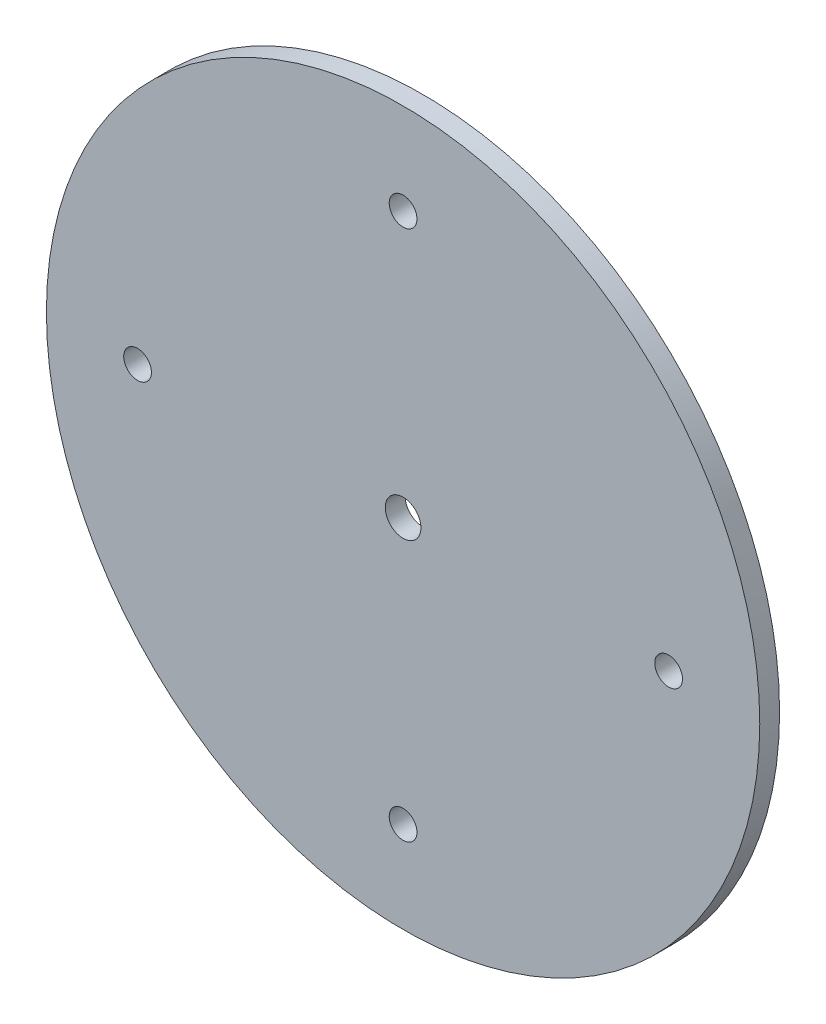
ISO-10303-21;
HEADER;
FILE_DESCRIPTION(('STEP AP214'),'2;1');
FILE_NAME('part.step','',(''),(''),'','','');
FILE_SCHEMA(('AUTOMOTIVE_DESIGN { 1 0 10303 214 1 1 1 1 }'));
ENDSEC;
DATA;
#1=APPLICATION_CONTEXT('core data for automotive mechanical design processes');
#2=APPLICATION_PROTOCOL_DEFINITION('international standard','automotive_design',2000,#1);
#3=PRODUCT_CONTEXT('',#1,'mechanical');
#4=PRODUCT('Part','Part','',(#3));
#5=PRODUCT_RELATED_PRODUCT_CATEGORY('part','',(#4));
#6=PRODUCT_DEFINITION_FORMATION('','',#4);
#7=PRODUCT_DEFINITION_CONTEXT('part definition',#1,'design');
#8=PRODUCT_DEFINITION('design','',#6,#7);
#9=PRODUCT_DEFINITION_SHAPE('','',#8);
#10=(LENGTH_UNIT() NAMED_UNIT(*) SI_UNIT(.MILLI.,.METRE.));
#11=(NAMED_UNIT(*) PLANE_ANGLE_UNIT() SI_UNIT($,.RADIAN.));
#12=(NAMED_UNIT(*) SI_UNIT($,.STERADIAN.) SOLID_ANGLE_UNIT());
#13=UNCERTAINTY_MEASURE_WITH_UNIT(LENGTH_MEASURE(1.E-05),#10,'distance_accuracy_value','');
#14=(GEOMETRIC_REPRESENTATION_CONTEXT(3) GLOBAL_UNCERTAINTY_ASSIGNED_CONTEXT((#13)) GLOBAL_UNIT_ASSIGNED_CONTEXT((#10,
#11,#12)) REPRESENTATION_CONTEXT('',''));
#15=CARTESIAN_POINT('',(0.,0.,0.));
#16=DIRECTION('',(0.,0.,1.));
#17=DIRECTION('',(1.,0.,0.));
#18=AXIS2_PLACEMENT_3D('',#15,#16,#17);
#19=CARTESIAN_POINT('',(0.,0.,0.));
#20=DIRECTION('',(0.,0.,1.));
#21=DIRECTION('',(1.,0.,0.));
#22=AXIS2_PLACEMENT_3D('',#19,#20,#21);
#23=PLANE('',#22);
#24=CARTESIAN_POINT('',(0.,0.,0.));
#25=DIRECTION('',(0.,0.,1.));
#26=DIRECTION('',(1.,0.,0.));
#27=AXIS2_PLACEMENT_3D('',#24,#25,#26);
#28=CIRCLE('',#27,2.25);
#29=CARTESIAN_POINT('',(2.25,0.,0.));
#30=VERTEX_POINT('',#29);
#31=EDGE_CURVE('E72',#30,#30,#28,.T.);
#32=ORIENTED_EDGE('',*,*,#31,.T.);
#33=EDGE_LOOP('',(#32));
#34=FACE_BOUND('',#33,.T.);
#35=CARTESIAN_POINT('',(0.,0.,0.));
#36=DIRECTION('',(0.,0.,-1.));
#37=DIRECTION('',(-1.,0.,0.));
#38=AXIS2_PLACEMENT_3D('',#35,#36,#37);
#39=CIRCLE('',#38,12.65);
#40=CARTESIAN_POINT('',(-12.65,0.,0.));
#41=VERTEX_POINT('',#40);
#42=EDGE_CURVE('E194',#41,#41,#39,.T.);
#43=ORIENTED_EDGE('',*,*,#42,.T.);
#44=EDGE_LOOP('',(#43));
#45=FACE_BOUND('',#44,.T.);
#46=ADVANCED_FACE('F33',(#34,#45),#23,.F.);
#47=CARTESIAN_POINT('',(0.,0.,2.5));
#48=DIRECTION('',(0.,0.,1.));
#49=DIRECTION('',(1.,0.,0.));
#50=AXIS2_PLACEMENT_3D('',#47,#48,#49);
#51=PLANE('',#50);
#52=CARTESIAN_POINT('',(0.,-33.5,2.5));
#53=DIRECTION('',(0.,0.,1.));
#54=DIRECTION('',(1.,0.,0.));
#55=AXIS2_PLACEMENT_3D('',#52,#53,#54);
#56=CIRCLE('',#55,1.75000000000023);
#57=CARTESIAN_POINT('',(1.75000000000023,-33.5,2.5));
#58=VERTEX_POINT('',#57);
#59=EDGE_CURVE('E57',#58,#58,#56,.T.);
#60=ORIENTED_EDGE('',*,*,#59,.F.);
#61=EDGE_LOOP('',(#60));
#62=FACE_BOUND('',#61,.T.);
#63=CARTESIAN_POINT('',(0.,33.5,2.5));
#64=DIRECTION('',(0.,0.,1.));
#65=DIRECTION('',(1.,0.,0.));
#66=AXIS2_PLACEMENT_3D('',#63,#64,#65);
#67=CIRCLE('',#66,1.75);
#68=CARTESIAN_POINT('',(1.75,33.5,2.5));
#69=VERTEX_POINT('',#68);
#70=EDGE_CURVE('E69',#69,#69,#67,.T.);
#71=ORIENTED_EDGE('',*,*,#70,.F.);
#72=EDGE_LOOP('',(#71));
#73=FACE_BOUND('',#72,.T.);
#74=CARTESIAN_POINT('',(0.,0.,2.5));
#75=DIRECTION('',(0.,0.,1.));
#76=DIRECTION('',(1.,0.,0.));
#77=AXIS2_PLACEMENT_3D('',#74,#75,#76);
#78=CIRCLE('',#77,45.);
#79=CARTESIAN_POINT('',(45.,0.,2.5));
#80=VERTEX_POINT('',#79);
#81=EDGE_CURVE('E41',#80,#80,#78,.T.);
#82=ORIENTED_EDGE('',*,*,#81,.T.);
#83=EDGE_LOOP('',(#82));
#84=FACE_BOUND('',#83,.T.);
#85=CARTESIAN_POINT('',(0.,0.,2.5));
#86=DIRECTION('',(0.,0.,1.));
#87=DIRECTION('',(1.,0.,0.));
#88=AXIS2_PLACEMENT_3D('',#85,#86,#87);
#89=CIRCLE('',#88,2.25);
#90=CARTESIAN_POINT('',(2.25,0.,2.5));
#91=VERTEX_POINT('',#90);
#92=EDGE_CURVE('E75',#91,#91,#89,.T.);
#93=ORIENTED_EDGE('',*,*,#92,.F.);
#94=EDGE_LOOP('',(#93));
#95=FACE_BOUND('',#94,.T.);
#96=CARTESIAN_POINT('',(33.5,0.,2.5));
#97=DIRECTION('',(0.,0.,1.));
#98=DIRECTION('',(1.,0.,0.));
#99=AXIS2_PLACEMENT_3D('',#96,#97,#98);
#100=CIRCLE('',#99,1.75000000000011);
#101=CARTESIAN_POINT('',(35.2500000000001,0.,2.5));
#102=VERTEX_POINT('',#101);
#103=EDGE_CURVE('E63',#102,#102,#100,.T.);
#104=ORIENTED_EDGE('',*,*,#103,.F.);
#105=EDGE_LOOP('',(#104));
#106=FACE_BOUND('',#105,.T.);
#107=CARTESIAN_POINT('',(-33.5,0.,2.5));
#108=DIRECTION('',(0.,0.,1.));
#109=DIRECTION('',(1.,0.,0.));
#110=AXIS2_PLACEMENT_3D('',#107,#108,#109);
#111=CIRCLE('',#110,1.75000000000034);
#112=CARTESIAN_POINT('',(-31.7499999999997,0.,2.5));
#113=VERTEX_POINT('',#112);
#114=EDGE_CURVE('E50',#113,#113,#111,.T.);
#115=ORIENTED_EDGE('',*,*,#114,.F.);
#116=EDGE_LOOP('',(#115));
#117=FACE_BOUND('',#116,.T.);
#118=ADVANCED_FACE('F99',(#62,#73,#84,#95,#106,#117),#51,.T.);
#119=CARTESIAN_POINT('',(0.,0.,0.));
#120=DIRECTION('',(0.,0.,-1.));
#121=DIRECTION('',(-1.,0.,0.));
#122=AXIS2_PLACEMENT_3D('',#119,#120,#121);
#123=CIRCLE('',#122,29.85);
#124=CARTESIAN_POINT('',(-29.85,0.,0.));
#125=VERTEX_POINT('',#124);
#126=EDGE_CURVE('E10',#125,#125,#123,.T.);
#127=ORIENTED_EDGE('',*,*,#126,.F.);
#128=EDGE_LOOP('',(#127));
#129=FACE_BOUND('',#128,.T.);
#130=CARTESIAN_POINT('',(0.,0.,0.));
#131=DIRECTION('',(0.,0.,1.));
#132=DIRECTION('',(1.,0.,0.));
#133=AXIS2_PLACEMENT_3D('',#130,#131,#132);
#134=CIRCLE('',#133,45.);
#135=CARTESIAN_POINT('',(45.,0.,0.));
#136=VERTEX_POINT('',#135);
#137=EDGE_CURVE('E37',#136,#136,#134,.T.);
#138=ORIENTED_EDGE('',*,*,#137,.F.);
#139=EDGE_LOOP('',(#138));
#140=FACE_BOUND('',#139,.T.);
#141=CARTESIAN_POINT('',(0.,33.5,0.));
#142=DIRECTION('',(0.,0.,1.));
#143=DIRECTION('',(1.,0.,0.));
#144=AXIS2_PLACEMENT_3D('',#141,#142,#143);
#145=CIRCLE('',#144,1.75);
#146=CARTESIAN_POINT('',(1.75,33.5,0.));
#147=VERTEX_POINT('',#146);
#148=EDGE_CURVE('E66',#147,#147,#145,.T.);
#149=ORIENTED_EDGE('',*,*,#148,.T.);
#150=EDGE_LOOP('',(#149));
#151=FACE_BOUND('',#150,.T.);
#152=CARTESIAN_POINT('',(33.5,0.,0.));
#153=DIRECTION('',(0.,0.,1.));
#154=DIRECTION('',(1.,0.,0.));
#155=AXIS2_PLACEMENT_3D('',#152,#153,#154);
#156=CIRCLE('',#155,1.75000000000011);
#157=CARTESIAN_POINT('',(35.2500000000001,0.,0.));
#158=VERTEX_POINT('',#157);
#159=EDGE_CURVE('E60',#158,#158,#156,.T.);
#160=ORIENTED_EDGE('',*,*,#159,.T.);
#161=EDGE_LOOP('',(#160));
#162=FACE_BOUND('',#161,.T.);
#163=CARTESIAN_POINT('',(0.,-33.5,0.));
#164=DIRECTION('',(0.,0.,1.));
#165=DIRECTION('',(1.,0.,0.));
#166=AXIS2_PLACEMENT_3D('',#163,#164,#165);
#167=CIRCLE('',#166,1.75000000000023);
#168=CARTESIAN_POINT('',(1.75000000000023,-33.5,0.));
#169=VERTEX_POINT('',#168);
#170=EDGE_CURVE('E53',#169,#169,#167,.T.);
#171=ORIENTED_EDGE('',*,*,#170,.T.);
#172=EDGE_LOOP('',(#171));
#173=FACE_BOUND('',#172,.T.);
#174=CARTESIAN_POINT('',(-33.5,0.,0.));
#175=DIRECTION('',(0.,0.,1.));
#176=DIRECTION('',(1.,0.,0.));
#177=AXIS2_PLACEMENT_3D('',#174,#175,#176);
#178=CIRCLE('',#177,1.75000000000034);
#179=CARTESIAN_POINT('',(-31.7499999999997,0.,0.));
#180=VERTEX_POINT('',#179);
#181=EDGE_CURVE('E54',#180,#180,#178,.T.);
#182=ORIENTED_EDGE('',*,*,#181,.T.);
#183=EDGE_LOOP('',(#182));
#184=FACE_BOUND('',#183,.T.);
#185=ADVANCED_FACE('F95',(#129,#140,#151,#162,#173,#184),#23,.F.);
#186=CARTESIAN_POINT('',(0.,0.,2.5));
#187=DIRECTION('',(0.,0.,-1.));
#188=DIRECTION('',(-1.,0.,0.));
#189=AXIS2_PLACEMENT_3D('',#186,#187,#188);
#190=CYLINDRICAL_SURFACE('',#189,45.);
#191=ORIENTED_EDGE('',*,*,#81,.F.);
#192=EDGE_LOOP('',(#191));
#193=FACE_BOUND('',#192,.T.);
#194=ORIENTED_EDGE('',*,*,#137,.T.);
#195=EDGE_LOOP('',(#194));
#196=FACE_BOUND('',#195,.T.);
#197=ADVANCED_FACE('F35',(#193,#196),#190,.T.);
#198=CARTESIAN_POINT('',(0.,0.,2.5));
#199=DIRECTION('',(0.,0.,-1.));
#200=DIRECTION('',(-1.,0.,0.));
#201=AXIS2_PLACEMENT_3D('',#198,#199,#200);
#202=CYLINDRICAL_SURFACE('',#201,2.25);
#203=ORIENTED_EDGE('',*,*,#92,.T.);
#204=EDGE_LOOP('',(#203));
#205=FACE_BOUND('',#204,.T.);
#206=ORIENTED_EDGE('',*,*,#31,.F.);
#207=EDGE_LOOP('',(#206));
#208=FACE_BOUND('',#207,.T.);
#209=ADVANCED_FACE('F83',(#205,#208),#202,.F.);
#210=CARTESIAN_POINT('',(0.,33.5,2.5));
#211=DIRECTION('',(0.,0.,-1.));
#212=DIRECTION('',(-1.,0.,0.));
#213=AXIS2_PLACEMENT_3D('',#210,#211,#212);
#214=CYLINDRICAL_SURFACE('',#213,1.75);
#215=ORIENTED_EDGE('',*,*,#70,.T.);
#216=EDGE_LOOP('',(#215));
#217=FACE_BOUND('',#216,.T.);
#218=ORIENTED_EDGE('',*,*,#148,.F.);
#219=EDGE_LOOP('',(#218));
#220=FACE_BOUND('',#219,.T.);
#221=ADVANCED_FACE('F85',(#217,#220),#214,.F.);
#222=CARTESIAN_POINT('',(33.5,0.,2.5));
#223=DIRECTION('',(0.,0.,-1.));
#224=DIRECTION('',(-1.,0.,0.));
#225=AXIS2_PLACEMENT_3D('',#222,#223,#224);
#226=CYLINDRICAL_SURFACE('',#225,1.75000000000011);
#227=ORIENTED_EDGE('',*,*,#103,.T.);
#228=EDGE_LOOP('',(#227));
#229=FACE_BOUND('',#228,.T.);
#230=ORIENTED_EDGE('',*,*,#159,.F.);
#231=EDGE_LOOP('',(#230));
#232=FACE_BOUND('',#231,.T.);
#233=ADVANCED_FACE('F92',(#229,#232),#226,.F.);
#234=CARTESIAN_POINT('',(0.,-33.5,2.5));
#235=DIRECTION('',(0.,0.,-1.));
#236=DIRECTION('',(-1.,0.,0.));
#237=AXIS2_PLACEMENT_3D('',#234,#235,#236);
#238=CYLINDRICAL_SURFACE('',#237,1.75000000000023);
#239=ORIENTED_EDGE('',*,*,#59,.T.);
#240=EDGE_LOOP('',(#239));
#241=FACE_BOUND('',#240,.T.);
#242=ORIENTED_EDGE('',*,*,#170,.F.);
#243=EDGE_LOOP('',(#242));
#244=FACE_BOUND('',#243,.T.);
#245=ADVANCED_FACE('F125',(#241,#244),#238,.F.);
#246=CARTESIAN_POINT('',(-33.5,0.,2.5));
#247=DIRECTION('',(0.,0.,-1.));
#248=DIRECTION('',(-1.,0.,0.));
#249=AXIS2_PLACEMENT_3D('',#246,#247,#248);
#250=CYLINDRICAL_SURFACE('',#249,1.75000000000034);
#251=ORIENTED_EDGE('',*,*,#114,.T.);
#252=EDGE_LOOP('',(#251));
#253=FACE_BOUND('',#252,.T.);
#254=ORIENTED_EDGE('',*,*,#181,.F.);
#255=EDGE_LOOP('',(#254));
#256=FACE_BOUND('',#255,.T.);
#257=ADVANCED_FACE('F122',(#253,#256),#250,.F.);
#258=CARTESIAN_POINT('',(0.,0.,-1.));
#259=DIRECTION('',(0.,0.,-1.));
#260=DIRECTION('',(-1.,0.,0.));
#261=AXIS2_PLACEMENT_3D('',#258,#259,#260);
#262=PLANE('',#261);
#263=CARTESIAN_POINT('',(0.,0.,-1.));
#264=DIRECTION('',(0.,0.,-1.));
#265=DIRECTION('',(-1.,0.,0.));
#266=AXIS2_PLACEMENT_3D('',#263,#264,#265);
#267=CIRCLE('',#266,29.85);
#268=CARTESIAN_POINT('',(-29.85,0.,-1.));
#269=VERTEX_POINT('',#268);
#270=EDGE_CURVE('E48',#269,#269,#267,.T.);
#271=ORIENTED_EDGE('',*,*,#270,.T.);
#272=EDGE_LOOP('',(#271));
#273=FACE_BOUND('',#272,.T.);
#274=CARTESIAN_POINT('',(0.,0.,-1.));
#275=DIRECTION('',(0.,0.,-1.));
#276=DIRECTION('',(-1.,0.,0.));
#277=AXIS2_PLACEMENT_3D('',#274,#275,#276);
#278=CIRCLE('',#277,12.65);
#279=CARTESIAN_POINT('',(-12.65,0.,-1.));
#280=VERTEX_POINT('',#279);
#281=EDGE_CURVE('E191',#280,#280,#278,.T.);
#282=ORIENTED_EDGE('',*,*,#281,.F.);
#283=EDGE_LOOP('',(#282));
#284=FACE_BOUND('',#283,.T.);
#285=ADVANCED_FACE('F124',(#273,#284),#262,.T.);
#286=CARTESIAN_POINT('',(0.,0.,-1.));
#287=DIRECTION('',(0.,0.,1.));
#288=DIRECTION('',(1.,0.,0.));
#289=AXIS2_PLACEMENT_3D('',#286,#287,#288);
#290=CYLINDRICAL_SURFACE('',#289,29.85);
#291=ORIENTED_EDGE('',*,*,#270,.F.);
#292=EDGE_LOOP('',(#291));
#293=FACE_BOUND('',#292,.T.);
#294=ORIENTED_EDGE('',*,*,#126,.T.);
#295=EDGE_LOOP('',(#294));
#296=FACE_BOUND('',#295,.T.);
#297=ADVANCED_FACE('F132',(#293,#296),#290,.T.);
#298=CARTESIAN_POINT('',(0.,0.,-1.));
#299=DIRECTION('',(0.,0.,1.));
#300=DIRECTION('',(1.,0.,0.));
#301=AXIS2_PLACEMENT_3D('',#298,#299,#300);
#302=CYLINDRICAL_SURFACE('',#301,12.65);
#303=ORIENTED_EDGE('',*,*,#281,.T.);
#304=EDGE_LOOP('',(#303));
#305=FACE_BOUND('',#304,.T.);
#306=ORIENTED_EDGE('',*,*,#42,.F.);
#307=EDGE_LOOP('',(#306));
#308=FACE_BOUND('',#307,.T.);
#309=ADVANCED_FACE('F175',(#305,#308),#302,.F.);
#310=CLOSED_SHELL('',(#46,#118,#185,#197,#209,#221,#233,#245,#257,#285,#297,#309));
#311=MANIFOLD_SOLID_BREP('B2',#310);
#312=ADVANCED_BREP_SHAPE_REPRESENTATION('',(#18,#311),#14);
#313=SHAPE_DEFINITION_REPRESENTATION(#9,#312);
ENDSEC;
END-ISO-10303-21;
